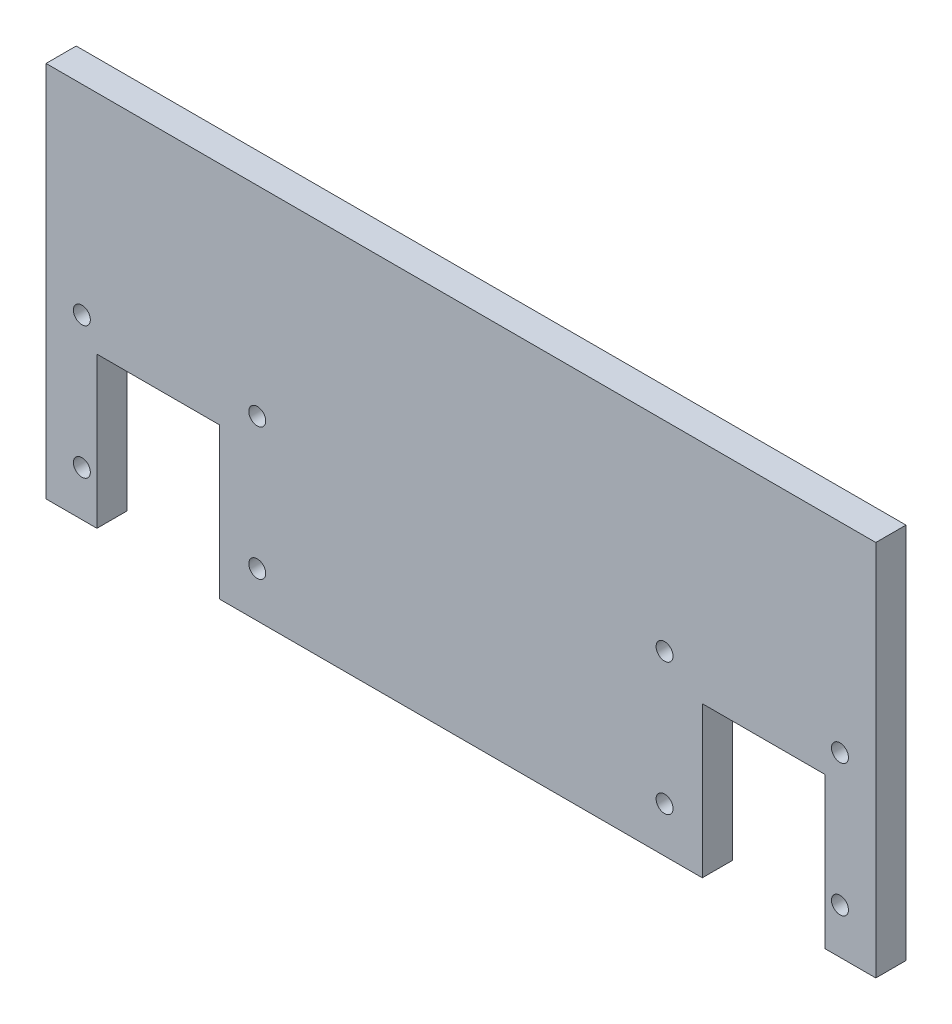
ISO-10303-21;
HEADER;
FILE_DESCRIPTION(('STEP AP214'),'2;1');
FILE_NAME('part.step','',(''),(''),'','','');
FILE_SCHEMA(('AUTOMOTIVE_DESIGN { 1 0 10303 214 1 1 1 1 }'));
ENDSEC;
DATA;
#1=APPLICATION_CONTEXT('core data for automotive mechanical design processes');
#2=APPLICATION_PROTOCOL_DEFINITION('international standard','automotive_design',2000,#1);
#3=PRODUCT_CONTEXT('',#1,'mechanical');
#4=PRODUCT('Part','Part','',(#3));
#5=PRODUCT_RELATED_PRODUCT_CATEGORY('part','',(#4));
#6=PRODUCT_DEFINITION_FORMATION('','',#4);
#7=PRODUCT_DEFINITION_CONTEXT('part definition',#1,'design');
#8=PRODUCT_DEFINITION('design','',#6,#7);
#9=PRODUCT_DEFINITION_SHAPE('','',#8);
#10=(LENGTH_UNIT() NAMED_UNIT(*) SI_UNIT(.MILLI.,.METRE.));
#11=(NAMED_UNIT(*) PLANE_ANGLE_UNIT() SI_UNIT($,.RADIAN.));
#12=(NAMED_UNIT(*) SI_UNIT($,.STERADIAN.) SOLID_ANGLE_UNIT());
#13=UNCERTAINTY_MEASURE_WITH_UNIT(LENGTH_MEASURE(1.E-05),#10,'distance_accuracy_value','');
#14=(GEOMETRIC_REPRESENTATION_CONTEXT(3) GLOBAL_UNCERTAINTY_ASSIGNED_CONTEXT((#13)) GLOBAL_UNIT_ASSIGNED_CONTEXT((#10,
#11,#12)) REPRESENTATION_CONTEXT('',''));
#15=CARTESIAN_POINT('',(0.,0.,0.));
#16=DIRECTION('',(0.,0.,1.));
#17=DIRECTION('',(1.,0.,0.));
#18=AXIS2_PLACEMENT_3D('',#15,#16,#17);
#19=CARTESIAN_POINT('',(0.,0.,8.));
#20=DIRECTION('',(0.,1.,0.));
#21=DIRECTION('',(0.,0.,1.));
#22=AXIS2_PLACEMENT_3D('',#19,#20,#21);
#23=PLANE('',#22);
#24=CARTESIAN_POINT('',(110.,0.,4.));
#25=DIRECTION('',(0.,-1.,0.));
#26=DIRECTION('',(0.,0.,-1.));
#27=AXIS2_PLACEMENT_3D('',#24,#25,#26);
#28=CIRCLE('',#27,2.);
#29=CARTESIAN_POINT('',(110.,0.,2.));
#30=VERTEX_POINT('',#29);
#31=EDGE_CURVE('E185',#30,#30,#28,.T.);
#32=ORIENTED_EDGE('',*,*,#31,.F.);
#33=EDGE_LOOP('',(#32));
#34=FACE_BOUND('',#33,.T.);
#35=DIRECTION('',(1.,0.,0.));
#36=VECTOR('',#35,1.);
#37=CARTESIAN_POINT('',(0.,0.,0.));
#38=LINE('',#37,#36);
#39=CARTESIAN_POINT('',(46.,0.,0.));
#40=VERTEX_POINT('',#39);
#41=CARTESIAN_POINT('',(174.,0.,0.));
#42=VERTEX_POINT('',#41);
#43=EDGE_CURVE('E147',#40,#42,#38,.T.);
#44=ORIENTED_EDGE('',*,*,#43,.T.);
#45=DIRECTION('',(0.,0.,1.));
#46=VECTOR('',#45,1.);
#47=CARTESIAN_POINT('',(174.,0.,0.));
#48=LINE('',#47,#46);
#49=CARTESIAN_POINT('',(174.,0.,8.));
#50=VERTEX_POINT('',#49);
#51=EDGE_CURVE('E234',#42,#50,#48,.T.);
#52=ORIENTED_EDGE('',*,*,#51,.T.);
#53=DIRECTION('',(1.,0.,0.));
#54=VECTOR('',#53,1.);
#55=CARTESIAN_POINT('',(0.,0.,8.));
#56=LINE('',#55,#54);
#57=CARTESIAN_POINT('',(46.,0.,8.));
#58=VERTEX_POINT('',#57);
#59=EDGE_CURVE('E180',#58,#50,#56,.T.);
#60=ORIENTED_EDGE('',*,*,#59,.F.);
#61=DIRECTION('',(0.,0.,1.));
#62=VECTOR('',#61,1.);
#63=CARTESIAN_POINT('',(46.,0.,0.));
#64=LINE('',#63,#62);
#65=EDGE_CURVE('E214',#40,#58,#64,.T.);
#66=ORIENTED_EDGE('',*,*,#65,.F.);
#67=EDGE_LOOP('',(#44,#52,#60,#66));
#68=FACE_BOUND('',#67,.T.);
#69=ADVANCED_FACE('F33',(#34,#68),#23,.F.);
#70=CARTESIAN_POINT('',(6.99999999999998,0.,4.));
#71=DIRECTION('',(0.,-1.,0.));
#72=DIRECTION('',(0.,0.,1.));
#73=AXIS2_PLACEMENT_3D('',#70,#71,#72);
#74=CIRCLE('',#73,2.);
#75=CARTESIAN_POINT('',(6.99999999999998,0.,6.));
#76=VERTEX_POINT('',#75);
#77=EDGE_CURVE('E191',#76,#76,#74,.T.);
#78=ORIENTED_EDGE('',*,*,#77,.F.);
#79=EDGE_LOOP('',(#78));
#80=FACE_BOUND('',#79,.T.);
#81=CARTESIAN_POINT('',(0.,0.,0.));
#82=VERTEX_POINT('',#81);
#83=CARTESIAN_POINT('',(13.5,0.,0.));
#84=VERTEX_POINT('',#83);
#85=EDGE_CURVE('E150',#82,#84,#38,.T.);
#86=ORIENTED_EDGE('',*,*,#85,.T.);
#87=DIRECTION('',(0.,0.,1.));
#88=VECTOR('',#87,1.);
#89=CARTESIAN_POINT('',(13.5,0.,0.));
#90=LINE('',#89,#88);
#91=CARTESIAN_POINT('',(13.5,0.,8.));
#92=VERTEX_POINT('',#91);
#93=EDGE_CURVE('E212',#84,#92,#90,.T.);
#94=ORIENTED_EDGE('',*,*,#93,.T.);
#95=CARTESIAN_POINT('',(0.,0.,8.));
#96=VERTEX_POINT('',#95);
#97=EDGE_CURVE('E176',#96,#92,#56,.T.);
#98=ORIENTED_EDGE('',*,*,#97,.F.);
#99=DIRECTION('',(0.,0.,-1.));
#100=VECTOR('',#99,1.);
#101=CARTESIAN_POINT('',(0.,0.,8.));
#102=LINE('',#101,#100);
#103=EDGE_CURVE('E11',#96,#82,#102,.T.);
#104=ORIENTED_EDGE('',*,*,#103,.T.);
#105=EDGE_LOOP('',(#86,#94,#98,#104));
#106=FACE_BOUND('',#105,.T.);
#107=ADVANCED_FACE('F330',(#80,#106),#23,.F.);
#108=CARTESIAN_POINT('',(0.,0.,8.));
#109=DIRECTION('',(1.,0.,0.));
#110=DIRECTION('',(0.,0.,-1.));
#111=AXIS2_PLACEMENT_3D('',#108,#109,#110);
#112=PLANE('',#111);
#113=DIRECTION('',(0.,-1.,0.));
#114=VECTOR('',#113,1.);
#115=CARTESIAN_POINT('',(0.,0.,0.));
#116=LINE('',#115,#114);
#117=CARTESIAN_POINT('',(0.,100.,0.));
#118=VERTEX_POINT('',#117);
#119=EDGE_CURVE('E148',#118,#82,#116,.T.);
#120=ORIENTED_EDGE('',*,*,#119,.T.);
#121=ORIENTED_EDGE('',*,*,#103,.F.);
#122=DIRECTION('',(0.,-1.,0.));
#123=VECTOR('',#122,1.);
#124=CARTESIAN_POINT('',(0.,0.,8.));
#125=LINE('',#124,#123);
#126=CARTESIAN_POINT('',(0.,100.,8.));
#127=VERTEX_POINT('',#126);
#128=EDGE_CURVE('E163',#127,#96,#125,.T.);
#129=ORIENTED_EDGE('',*,*,#128,.F.);
#130=DIRECTION('',(0.,0.,-1.));
#131=VECTOR('',#130,1.);
#132=CARTESIAN_POINT('',(0.,100.,8.));
#133=LINE('',#132,#131);
#134=EDGE_CURVE('E166',#127,#118,#133,.T.);
#135=ORIENTED_EDGE('',*,*,#134,.T.);
#136=EDGE_LOOP('',(#120,#121,#129,#135));
#137=FACE_BOUND('',#136,.T.);
#138=ADVANCED_FACE('F35',(#137),#112,.F.);
#139=CARTESIAN_POINT('',(213.,0.,4.));
#140=DIRECTION('',(0.,-1.,0.));
#141=DIRECTION('',(0.,0.,-1.));
#142=AXIS2_PLACEMENT_3D('',#139,#140,#141);
#143=CIRCLE('',#142,2.);
#144=CARTESIAN_POINT('',(213.,0.,2.));
#145=VERTEX_POINT('',#144);
#146=EDGE_CURVE('E198',#145,#145,#143,.T.);
#147=ORIENTED_EDGE('',*,*,#146,.F.);
#148=EDGE_LOOP('',(#147));
#149=FACE_BOUND('',#148,.T.);
#150=CARTESIAN_POINT('',(206.5,0.,8.));
#151=VERTEX_POINT('',#150);
#152=CARTESIAN_POINT('',(220.,0.,8.));
#153=VERTEX_POINT('',#152);
#154=EDGE_CURVE('E139',#151,#153,#56,.T.);
#155=ORIENTED_EDGE('',*,*,#154,.F.);
#156=DIRECTION('',(0.,0.,1.));
#157=VECTOR('',#156,1.);
#158=CARTESIAN_POINT('',(206.5,0.,0.));
#159=LINE('',#158,#157);
#160=CARTESIAN_POINT('',(206.5,0.,0.));
#161=VERTEX_POINT('',#160);
#162=EDGE_CURVE('E126',#161,#151,#159,.T.);
#163=ORIENTED_EDGE('',*,*,#162,.F.);
#164=CARTESIAN_POINT('',(220.,0.,0.));
#165=VERTEX_POINT('',#164);
#166=EDGE_CURVE('E137',#161,#165,#38,.T.);
#167=ORIENTED_EDGE('',*,*,#166,.T.);
#168=DIRECTION('',(0.,0.,-1.));
#169=VECTOR('',#168,1.);
#170=CARTESIAN_POINT('',(220.,0.,8.));
#171=LINE('',#170,#169);
#172=EDGE_CURVE('E41',#153,#165,#171,.T.);
#173=ORIENTED_EDGE('',*,*,#172,.F.);
#174=EDGE_LOOP('',(#155,#163,#167,#173));
#175=FACE_BOUND('',#174,.T.);
#176=ADVANCED_FACE('F135',(#149,#175),#23,.F.);
#177=CARTESIAN_POINT('',(220.,0.,8.));
#178=DIRECTION('',(-1.,0.,0.));
#179=DIRECTION('',(0.,0.,1.));
#180=AXIS2_PLACEMENT_3D('',#177,#178,#179);
#181=PLANE('',#180);
#182=DIRECTION('',(0.,1.,0.));
#183=VECTOR('',#182,1.);
#184=CARTESIAN_POINT('',(220.,0.,0.));
#185=LINE('',#184,#183);
#186=CARTESIAN_POINT('',(220.,100.,0.));
#187=VERTEX_POINT('',#186);
#188=EDGE_CURVE('E146',#165,#187,#185,.T.);
#189=ORIENTED_EDGE('',*,*,#188,.T.);
#190=DIRECTION('',(0.,0.,-1.));
#191=VECTOR('',#190,1.);
#192=CARTESIAN_POINT('',(220.,100.,8.));
#193=LINE('',#192,#191);
#194=CARTESIAN_POINT('',(220.,100.,8.));
#195=VERTEX_POINT('',#194);
#196=EDGE_CURVE('E169',#195,#187,#193,.T.);
#197=ORIENTED_EDGE('',*,*,#196,.F.);
#198=DIRECTION('',(0.,1.,0.));
#199=VECTOR('',#198,1.);
#200=CARTESIAN_POINT('',(220.,0.,8.));
#201=LINE('',#200,#199);
#202=EDGE_CURVE('E173',#153,#195,#201,.T.);
#203=ORIENTED_EDGE('',*,*,#202,.F.);
#204=ORIENTED_EDGE('',*,*,#172,.T.);
#205=EDGE_LOOP('',(#189,#197,#203,#204));
#206=FACE_BOUND('',#205,.T.);
#207=ADVANCED_FACE('F172',(#206),#181,.F.);
#208=CARTESIAN_POINT('',(0.,100.,8.));
#209=DIRECTION('',(0.,-1.,0.));
#210=DIRECTION('',(0.,0.,-1.));
#211=AXIS2_PLACEMENT_3D('',#208,#209,#210);
#212=PLANE('',#211);
#213=DIRECTION('',(-1.,0.,0.));
#214=VECTOR('',#213,1.);
#215=CARTESIAN_POINT('',(0.,100.,0.));
#216=LINE('',#215,#214);
#217=EDGE_CURVE('E159',#187,#118,#216,.T.);
#218=ORIENTED_EDGE('',*,*,#217,.T.);
#219=ORIENTED_EDGE('',*,*,#134,.F.);
#220=DIRECTION('',(-1.,0.,0.));
#221=VECTOR('',#220,1.);
#222=CARTESIAN_POINT('',(0.,100.,8.));
#223=LINE('',#222,#221);
#224=EDGE_CURVE('E170',#195,#127,#223,.T.);
#225=ORIENTED_EDGE('',*,*,#224,.F.);
#226=ORIENTED_EDGE('',*,*,#196,.T.);
#227=EDGE_LOOP('',(#218,#219,#225,#226));
#228=FACE_BOUND('',#227,.T.);
#229=ADVANCED_FACE('F305',(#228),#212,.F.);
#230=CARTESIAN_POINT('',(0.,0.,8.));
#231=DIRECTION('',(0.,0.,-1.));
#232=DIRECTION('',(-1.,0.,0.));
#233=AXIS2_PLACEMENT_3D('',#230,#231,#232);
#234=PLANE('',#233);
#235=CARTESIAN_POINT('',(164.,47.,8.));
#236=DIRECTION('',(0.,0.,-1.));
#237=DIRECTION('',(-1.,0.,0.));
#238=AXIS2_PLACEMENT_3D('',#235,#236,#237);
#239=CIRCLE('',#238,2.25000000000001);
#240=CARTESIAN_POINT('',(161.75,47.,8.));
#241=VERTEX_POINT('',#240);
#242=EDGE_CURVE('E249',#241,#241,#239,.T.);
#243=ORIENTED_EDGE('',*,*,#242,.T.);
#244=EDGE_LOOP('',(#243));
#245=FACE_BOUND('',#244,.T.);
#246=CARTESIAN_POINT('',(164.,12.,8.));
#247=DIRECTION('',(0.,0.,-1.));
#248=DIRECTION('',(-1.,0.,0.));
#249=AXIS2_PLACEMENT_3D('',#246,#247,#248);
#250=CIRCLE('',#249,2.25000000000001);
#251=CARTESIAN_POINT('',(161.75,12.,8.));
#252=VERTEX_POINT('',#251);
#253=EDGE_CURVE('E252',#252,#252,#250,.T.);
#254=ORIENTED_EDGE('',*,*,#253,.T.);
#255=EDGE_LOOP('',(#254));
#256=FACE_BOUND('',#255,.T.);
#257=CARTESIAN_POINT('',(56.,12.,8.));
#258=DIRECTION('',(0.,0.,-1.));
#259=DIRECTION('',(-1.,0.,0.));
#260=AXIS2_PLACEMENT_3D('',#257,#258,#259);
#261=CIRCLE('',#260,2.25);
#262=CARTESIAN_POINT('',(53.75,12.,8.));
#263=VERTEX_POINT('',#262);
#264=EDGE_CURVE('E255',#263,#263,#261,.T.);
#265=ORIENTED_EDGE('',*,*,#264,.T.);
#266=EDGE_LOOP('',(#265));
#267=FACE_BOUND('',#266,.T.);
#268=CARTESIAN_POINT('',(56.,47.,8.));
#269=DIRECTION('',(0.,0.,-1.));
#270=DIRECTION('',(-1.,0.,0.));
#271=AXIS2_PLACEMENT_3D('',#268,#269,#270);
#272=CIRCLE('',#271,2.25);
#273=CARTESIAN_POINT('',(53.75,47.,8.));
#274=VERTEX_POINT('',#273);
#275=EDGE_CURVE('E258',#274,#274,#272,.T.);
#276=ORIENTED_EDGE('',*,*,#275,.T.);
#277=EDGE_LOOP('',(#276));
#278=FACE_BOUND('',#277,.T.);
#279=CARTESIAN_POINT('',(210.5,12.,8.));
#280=DIRECTION('',(0.,0.,-1.));
#281=DIRECTION('',(-1.,0.,0.));
#282=AXIS2_PLACEMENT_3D('',#279,#280,#281);
#283=CIRCLE('',#282,2.25000000000001);
#284=CARTESIAN_POINT('',(208.25,12.,8.));
#285=VERTEX_POINT('',#284);
#286=EDGE_CURVE('E261',#285,#285,#283,.T.);
#287=ORIENTED_EDGE('',*,*,#286,.T.);
#288=EDGE_LOOP('',(#287));
#289=FACE_BOUND('',#288,.T.);
#290=CARTESIAN_POINT('',(210.5,47.,8.));
#291=DIRECTION('',(0.,0.,-1.));
#292=DIRECTION('',(-1.,0.,0.));
#293=AXIS2_PLACEMENT_3D('',#290,#291,#292);
#294=CIRCLE('',#293,2.25000000000001);
#295=CARTESIAN_POINT('',(208.25,47.,8.));
#296=VERTEX_POINT('',#295);
#297=EDGE_CURVE('E264',#296,#296,#294,.T.);
#298=ORIENTED_EDGE('',*,*,#297,.T.);
#299=EDGE_LOOP('',(#298));
#300=FACE_BOUND('',#299,.T.);
#301=CARTESIAN_POINT('',(9.5,47.,8.));
#302=DIRECTION('',(0.,0.,-1.));
#303=DIRECTION('',(-1.,0.,0.));
#304=AXIS2_PLACEMENT_3D('',#301,#302,#303);
#305=CIRCLE('',#304,2.25);
#306=CARTESIAN_POINT('',(7.25,47.,8.));
#307=VERTEX_POINT('',#306);
#308=EDGE_CURVE('E267',#307,#307,#305,.T.);
#309=ORIENTED_EDGE('',*,*,#308,.T.);
#310=EDGE_LOOP('',(#309));
#311=FACE_BOUND('',#310,.T.);
#312=CARTESIAN_POINT('',(9.5,12.,8.));
#313=DIRECTION('',(0.,0.,-1.));
#314=DIRECTION('',(-1.,0.,0.));
#315=AXIS2_PLACEMENT_3D('',#312,#313,#314);
#316=CIRCLE('',#315,2.25);
#317=CARTESIAN_POINT('',(7.25,12.,8.));
#318=VERTEX_POINT('',#317);
#319=EDGE_CURVE('E131',#318,#318,#316,.T.);
#320=ORIENTED_EDGE('',*,*,#319,.T.);
#321=EDGE_LOOP('',(#320));
#322=FACE_BOUND('',#321,.T.);
#323=ORIENTED_EDGE('',*,*,#59,.T.);
#324=DIRECTION('',(0.,1.,0.));
#325=VECTOR('',#324,1.);
#326=CARTESIAN_POINT('',(174.,0.,8.));
#327=LINE('',#326,#325);
#328=CARTESIAN_POINT('',(174.,40.,8.));
#329=VERTEX_POINT('',#328);
#330=EDGE_CURVE('E227',#50,#329,#327,.T.);
#331=ORIENTED_EDGE('',*,*,#330,.T.);
#332=DIRECTION('',(1.,0.,0.));
#333=VECTOR('',#332,1.);
#334=CARTESIAN_POINT('',(0.,40.,8.));
#335=LINE('',#334,#333);
#336=CARTESIAN_POINT('',(206.5,40.,8.));
#337=VERTEX_POINT('',#336);
#338=EDGE_CURVE('E230',#329,#337,#335,.T.);
#339=ORIENTED_EDGE('',*,*,#338,.T.);
#340=DIRECTION('',(0.,-1.,0.));
#341=VECTOR('',#340,1.);
#342=CARTESIAN_POINT('',(206.5,0.,8.));
#343=LINE('',#342,#341);
#344=EDGE_CURVE('E233',#337,#151,#343,.T.);
#345=ORIENTED_EDGE('',*,*,#344,.T.);
#346=ORIENTED_EDGE('',*,*,#154,.T.);
#347=ORIENTED_EDGE('',*,*,#202,.T.);
#348=ORIENTED_EDGE('',*,*,#224,.T.);
#349=ORIENTED_EDGE('',*,*,#128,.T.);
#350=ORIENTED_EDGE('',*,*,#97,.T.);
#351=DIRECTION('',(0.,1.,0.));
#352=VECTOR('',#351,1.);
#353=CARTESIAN_POINT('',(13.5,0.,8.));
#354=LINE('',#353,#352);
#355=CARTESIAN_POINT('',(13.5,40.,8.));
#356=VERTEX_POINT('',#355);
#357=EDGE_CURVE('E195',#92,#356,#354,.T.);
#358=ORIENTED_EDGE('',*,*,#357,.T.);
#359=DIRECTION('',(1.,0.,0.));
#360=VECTOR('',#359,1.);
#361=CARTESIAN_POINT('',(0.,40.,8.));
#362=LINE('',#361,#360);
#363=CARTESIAN_POINT('',(46.,40.,8.));
#364=VERTEX_POINT('',#363);
#365=EDGE_CURVE('E205',#356,#364,#362,.T.);
#366=ORIENTED_EDGE('',*,*,#365,.T.);
#367=DIRECTION('',(0.,-1.,0.));
#368=VECTOR('',#367,1.);
#369=CARTESIAN_POINT('',(46.,0.,8.));
#370=LINE('',#369,#368);
#371=EDGE_CURVE('E208',#364,#58,#370,.T.);
#372=ORIENTED_EDGE('',*,*,#371,.T.);
#373=EDGE_LOOP('',(#323,#331,#339,#345,#346,#347,#348,#349,#350,#358,#366,#372));
#374=FACE_BOUND('',#373,.T.);
#375=ADVANCED_FACE('F302',(#245,#256,#267,#278,#289,#300,#311,#322,#374),#234,.F.);
#376=CARTESIAN_POINT('',(0.,0.,0.));
#377=DIRECTION('',(0.,0.,-1.));
#378=DIRECTION('',(-1.,0.,0.));
#379=AXIS2_PLACEMENT_3D('',#376,#377,#378);
#380=PLANE('',#379);
#381=CARTESIAN_POINT('',(164.,47.,0.));
#382=DIRECTION('',(0.,0.,1.));
#383=DIRECTION('',(1.,0.,0.));
#384=AXIS2_PLACEMENT_3D('',#381,#382,#383);
#385=CIRCLE('',#384,2.25000000000001);
#386=CARTESIAN_POINT('',(166.25,47.,0.));
#387=VERTEX_POINT('',#386);
#388=EDGE_CURVE('E280',#387,#387,#385,.T.);
#389=ORIENTED_EDGE('',*,*,#388,.T.);
#390=EDGE_LOOP('',(#389));
#391=FACE_BOUND('',#390,.T.);
#392=CARTESIAN_POINT('',(164.,12.,0.));
#393=DIRECTION('',(0.,0.,1.));
#394=DIRECTION('',(1.,0.,0.));
#395=AXIS2_PLACEMENT_3D('',#392,#393,#394);
#396=CIRCLE('',#395,2.25000000000001);
#397=CARTESIAN_POINT('',(166.25,12.,0.));
#398=VERTEX_POINT('',#397);
#399=EDGE_CURVE('E283',#398,#398,#396,.T.);
#400=ORIENTED_EDGE('',*,*,#399,.T.);
#401=EDGE_LOOP('',(#400));
#402=FACE_BOUND('',#401,.T.);
#403=CARTESIAN_POINT('',(56.,12.,0.));
#404=DIRECTION('',(0.,0.,1.));
#405=DIRECTION('',(-1.,0.,0.));
#406=AXIS2_PLACEMENT_3D('',#403,#404,#405);
#407=CIRCLE('',#406,2.25);
#408=CARTESIAN_POINT('',(53.75,12.,0.));
#409=VERTEX_POINT('',#408);
#410=EDGE_CURVE('E286',#409,#409,#407,.T.);
#411=ORIENTED_EDGE('',*,*,#410,.T.);
#412=EDGE_LOOP('',(#411));
#413=FACE_BOUND('',#412,.T.);
#414=CARTESIAN_POINT('',(56.,47.,0.));
#415=DIRECTION('',(0.,0.,1.));
#416=DIRECTION('',(-1.,0.,0.));
#417=AXIS2_PLACEMENT_3D('',#414,#415,#416);
#418=CIRCLE('',#417,2.25);
#419=CARTESIAN_POINT('',(53.75,47.,0.));
#420=VERTEX_POINT('',#419);
#421=EDGE_CURVE('E275',#420,#420,#418,.T.);
#422=ORIENTED_EDGE('',*,*,#421,.T.);
#423=EDGE_LOOP('',(#422));
#424=FACE_BOUND('',#423,.T.);
#425=CARTESIAN_POINT('',(210.5,12.,0.));
#426=DIRECTION('',(0.,0.,1.));
#427=DIRECTION('',(-1.,0.,0.));
#428=AXIS2_PLACEMENT_3D('',#425,#426,#427);
#429=CIRCLE('',#428,2.25000000000001);
#430=CARTESIAN_POINT('',(208.25,12.,0.));
#431=VERTEX_POINT('',#430);
#432=EDGE_CURVE('E271',#431,#431,#429,.T.);
#433=ORIENTED_EDGE('',*,*,#432,.T.);
#434=EDGE_LOOP('',(#433));
#435=FACE_BOUND('',#434,.T.);
#436=CARTESIAN_POINT('',(210.5,47.,0.));
#437=DIRECTION('',(0.,0.,1.));
#438=DIRECTION('',(-1.,0.,0.));
#439=AXIS2_PLACEMENT_3D('',#436,#437,#438);
#440=CIRCLE('',#439,2.25000000000001);
#441=CARTESIAN_POINT('',(208.25,47.,0.));
#442=VERTEX_POINT('',#441);
#443=EDGE_CURVE('E274',#442,#442,#440,.T.);
#444=ORIENTED_EDGE('',*,*,#443,.T.);
#445=EDGE_LOOP('',(#444));
#446=FACE_BOUND('',#445,.T.);
#447=CARTESIAN_POINT('',(9.5,47.,0.));
#448=DIRECTION('',(0.,0.,1.));
#449=DIRECTION('',(1.,0.,0.));
#450=AXIS2_PLACEMENT_3D('',#447,#448,#449);
#451=CIRCLE('',#450,2.25);
#452=CARTESIAN_POINT('',(11.75,47.,0.));
#453=VERTEX_POINT('',#452);
#454=EDGE_CURVE('E270',#453,#453,#451,.T.);
#455=ORIENTED_EDGE('',*,*,#454,.T.);
#456=EDGE_LOOP('',(#455));
#457=FACE_BOUND('',#456,.T.);
#458=CARTESIAN_POINT('',(9.5,12.,0.));
#459=DIRECTION('',(0.,0.,1.));
#460=DIRECTION('',(1.,0.,0.));
#461=AXIS2_PLACEMENT_3D('',#458,#459,#460);
#462=CIRCLE('',#461,2.25);
#463=CARTESIAN_POINT('',(11.75,12.,0.));
#464=VERTEX_POINT('',#463);
#465=EDGE_CURVE('E246',#464,#464,#462,.T.);
#466=ORIENTED_EDGE('',*,*,#465,.T.);
#467=EDGE_LOOP('',(#466));
#468=FACE_BOUND('',#467,.T.);
#469=DIRECTION('',(0.,-1.,0.));
#470=VECTOR('',#469,1.);
#471=CARTESIAN_POINT('',(174.,0.,0.));
#472=LINE('',#471,#470);
#473=CARTESIAN_POINT('',(174.,40.,0.));
#474=VERTEX_POINT('',#473);
#475=EDGE_CURVE('E140',#474,#42,#472,.T.);
#476=ORIENTED_EDGE('',*,*,#475,.T.);
#477=ORIENTED_EDGE('',*,*,#43,.F.);
#478=DIRECTION('',(0.,1.,0.));
#479=VECTOR('',#478,1.);
#480=CARTESIAN_POINT('',(46.,0.,0.));
#481=LINE('',#480,#479);
#482=CARTESIAN_POINT('',(46.,40.,0.));
#483=VERTEX_POINT('',#482);
#484=EDGE_CURVE('E221',#40,#483,#481,.T.);
#485=ORIENTED_EDGE('',*,*,#484,.T.);
#486=DIRECTION('',(-1.,0.,0.));
#487=VECTOR('',#486,1.);
#488=CARTESIAN_POINT('',(13.5,40.,0.));
#489=LINE('',#488,#487);
#490=CARTESIAN_POINT('',(13.5,40.,0.));
#491=VERTEX_POINT('',#490);
#492=EDGE_CURVE('E56',#483,#491,#489,.T.);
#493=ORIENTED_EDGE('',*,*,#492,.T.);
#494=DIRECTION('',(0.,-1.,0.));
#495=VECTOR('',#494,1.);
#496=CARTESIAN_POINT('',(13.5,0.,0.));
#497=LINE('',#496,#495);
#498=EDGE_CURVE('E224',#491,#84,#497,.T.);
#499=ORIENTED_EDGE('',*,*,#498,.T.);
#500=ORIENTED_EDGE('',*,*,#85,.F.);
#501=ORIENTED_EDGE('',*,*,#119,.F.);
#502=ORIENTED_EDGE('',*,*,#217,.F.);
#503=ORIENTED_EDGE('',*,*,#188,.F.);
#504=ORIENTED_EDGE('',*,*,#166,.F.);
#505=DIRECTION('',(0.,1.,0.));
#506=VECTOR('',#505,1.);
#507=CARTESIAN_POINT('',(206.5,0.,0.));
#508=LINE('',#507,#506);
#509=CARTESIAN_POINT('',(206.5,40.,0.));
#510=VERTEX_POINT('',#509);
#511=EDGE_CURVE('E123',#161,#510,#508,.T.);
#512=ORIENTED_EDGE('',*,*,#511,.T.);
#513=DIRECTION('',(-1.,0.,0.));
#514=VECTOR('',#513,1.);
#515=CARTESIAN_POINT('',(206.5,40.,0.));
#516=LINE('',#515,#514);
#517=EDGE_CURVE('E48',#510,#474,#516,.T.);
#518=ORIENTED_EDGE('',*,*,#517,.T.);
#519=EDGE_LOOP('',(#476,#477,#485,#493,#499,#500,#501,#502,#503,#504,#512,#518));
#520=FACE_BOUND('',#519,.T.);
#521=ADVANCED_FACE('F144',(#391,#402,#413,#424,#435,#446,#457,#468,#520),#380,.T.);
#522=CARTESIAN_POINT('',(110.,8.,4.));
#523=DIRECTION('',(0.,-1.,0.));
#524=DIRECTION('',(0.,0.,-1.));
#525=AXIS2_PLACEMENT_3D('',#522,#523,#524);
#526=CYLINDRICAL_SURFACE('',#525,2.);
#527=CARTESIAN_POINT('',(110.,8.,4.));
#528=DIRECTION('',(0.,-1.,0.));
#529=DIRECTION('',(0.,0.,-1.));
#530=AXIS2_PLACEMENT_3D('',#527,#528,#529);
#531=CIRCLE('',#530,2.);
#532=CARTESIAN_POINT('',(110.,8.,2.));
#533=VERTEX_POINT('',#532);
#534=EDGE_CURVE('E153',#533,#533,#531,.T.);
#535=ORIENTED_EDGE('',*,*,#534,.F.);
#536=EDGE_LOOP('',(#535));
#537=FACE_BOUND('',#536,.T.);
#538=ORIENTED_EDGE('',*,*,#31,.T.);
#539=EDGE_LOOP('',(#538));
#540=FACE_BOUND('',#539,.T.);
#541=ADVANCED_FACE('F381',(#537,#540),#526,.F.);
#542=CARTESIAN_POINT('',(110.,8.,4.));
#543=DIRECTION('',(0.,-1.,0.));
#544=DIRECTION('',(0.,0.,-1.));
#545=AXIS2_PLACEMENT_3D('',#542,#543,#544);
#546=PLANE('',#545);
#547=ORIENTED_EDGE('',*,*,#534,.T.);
#548=EDGE_LOOP('',(#547));
#549=FACE_BOUND('',#548,.T.);
#550=ADVANCED_FACE('F377',(#549),#546,.T.);
#551=CARTESIAN_POINT('',(6.99999999999998,8.,4.));
#552=DIRECTION('',(0.,-1.,0.));
#553=DIRECTION('',(0.,0.,-1.));
#554=AXIS2_PLACEMENT_3D('',#551,#552,#553);
#555=CYLINDRICAL_SURFACE('',#554,2.);
#556=CARTESIAN_POINT('',(6.99999999999998,8.,4.));
#557=DIRECTION('',(0.,-1.,0.));
#558=DIRECTION('',(0.,0.,1.));
#559=AXIS2_PLACEMENT_3D('',#556,#557,#558);
#560=CIRCLE('',#559,2.);
#561=CARTESIAN_POINT('',(6.99999999999998,8.,6.));
#562=VERTEX_POINT('',#561);
#563=EDGE_CURVE('E194',#562,#562,#560,.T.);
#564=ORIENTED_EDGE('',*,*,#563,.F.);
#565=EDGE_LOOP('',(#564));
#566=FACE_BOUND('',#565,.T.);
#567=ORIENTED_EDGE('',*,*,#77,.T.);
#568=EDGE_LOOP('',(#567));
#569=FACE_BOUND('',#568,.T.);
#570=ADVANCED_FACE('F369',(#566,#569),#555,.F.);
#571=CARTESIAN_POINT('',(6.99999999999998,8.,4.));
#572=DIRECTION('',(0.,1.,0.));
#573=DIRECTION('',(0.,0.,1.));
#574=AXIS2_PLACEMENT_3D('',#571,#572,#573);
#575=PLANE('',#574);
#576=ORIENTED_EDGE('',*,*,#563,.T.);
#577=EDGE_LOOP('',(#576));
#578=FACE_BOUND('',#577,.T.);
#579=ADVANCED_FACE('F360',(#578),#575,.F.);
#580=CARTESIAN_POINT('',(213.,8.,4.));
#581=DIRECTION('',(0.,-1.,0.));
#582=DIRECTION('',(0.,0.,-1.));
#583=AXIS2_PLACEMENT_3D('',#580,#581,#582);
#584=CYLINDRICAL_SURFACE('',#583,2.);
#585=CARTESIAN_POINT('',(213.,8.,4.));
#586=DIRECTION('',(0.,-1.,0.));
#587=DIRECTION('',(0.,0.,-1.));
#588=AXIS2_PLACEMENT_3D('',#585,#586,#587);
#589=CIRCLE('',#588,2.);
#590=CARTESIAN_POINT('',(213.,8.,2.));
#591=VERTEX_POINT('',#590);
#592=EDGE_CURVE('E188',#591,#591,#589,.T.);
#593=ORIENTED_EDGE('',*,*,#592,.F.);
#594=EDGE_LOOP('',(#593));
#595=FACE_BOUND('',#594,.T.);
#596=ORIENTED_EDGE('',*,*,#146,.T.);
#597=EDGE_LOOP('',(#596));
#598=FACE_BOUND('',#597,.T.);
#599=ADVANCED_FACE('F357',(#595,#598),#584,.F.);
#600=CARTESIAN_POINT('',(213.,8.,4.));
#601=DIRECTION('',(0.,-1.,0.));
#602=DIRECTION('',(0.,0.,-1.));
#603=AXIS2_PLACEMENT_3D('',#600,#601,#602);
#604=PLANE('',#603);
#605=ORIENTED_EDGE('',*,*,#592,.T.);
#606=EDGE_LOOP('',(#605));
#607=FACE_BOUND('',#606,.T.);
#608=ADVANCED_FACE('F359',(#607),#604,.T.);
#609=CARTESIAN_POINT('',(13.5,0.,0.));
#610=DIRECTION('',(-1.,0.,0.));
#611=DIRECTION('',(0.,0.,1.));
#612=AXIS2_PLACEMENT_3D('',#609,#610,#611);
#613=PLANE('',#612);
#614=ORIENTED_EDGE('',*,*,#93,.F.);
#615=ORIENTED_EDGE('',*,*,#498,.F.);
#616=DIRECTION('',(0.,0.,1.));
#617=VECTOR('',#616,1.);
#618=CARTESIAN_POINT('',(13.5,40.,0.));
#619=LINE('',#618,#617);
#620=EDGE_CURVE('E211',#491,#356,#619,.T.);
#621=ORIENTED_EDGE('',*,*,#620,.T.);
#622=ORIENTED_EDGE('',*,*,#357,.F.);
#623=EDGE_LOOP('',(#614,#615,#621,#622));
#624=FACE_BOUND('',#623,.T.);
#625=ADVANCED_FACE('F329',(#624),#613,.F.);
#626=CARTESIAN_POINT('',(13.5,40.,0.));
#627=DIRECTION('',(0.,1.,0.));
#628=DIRECTION('',(0.,0.,1.));
#629=AXIS2_PLACEMENT_3D('',#626,#627,#628);
#630=PLANE('',#629);
#631=ORIENTED_EDGE('',*,*,#620,.F.);
#632=ORIENTED_EDGE('',*,*,#492,.F.);
#633=DIRECTION('',(0.,0.,1.));
#634=VECTOR('',#633,1.);
#635=CARTESIAN_POINT('',(46.,40.,0.));
#636=LINE('',#635,#634);
#637=EDGE_CURVE('E216',#483,#364,#636,.T.);
#638=ORIENTED_EDGE('',*,*,#637,.T.);
#639=ORIENTED_EDGE('',*,*,#365,.F.);
#640=EDGE_LOOP('',(#631,#632,#638,#639));
#641=FACE_BOUND('',#640,.T.);
#642=ADVANCED_FACE('F432',(#641),#630,.F.);
#643=CARTESIAN_POINT('',(46.,0.,0.));
#644=DIRECTION('',(1.,0.,0.));
#645=DIRECTION('',(0.,0.,-1.));
#646=AXIS2_PLACEMENT_3D('',#643,#644,#645);
#647=PLANE('',#646);
#648=ORIENTED_EDGE('',*,*,#637,.F.);
#649=ORIENTED_EDGE('',*,*,#484,.F.);
#650=ORIENTED_EDGE('',*,*,#65,.T.);
#651=ORIENTED_EDGE('',*,*,#371,.F.);
#652=EDGE_LOOP('',(#648,#649,#650,#651));
#653=FACE_BOUND('',#652,.T.);
#654=ADVANCED_FACE('F325',(#653),#647,.F.);
#655=CARTESIAN_POINT('',(174.,0.,0.));
#656=DIRECTION('',(-1.,0.,0.));
#657=DIRECTION('',(0.,0.,1.));
#658=AXIS2_PLACEMENT_3D('',#655,#656,#657);
#659=PLANE('',#658);
#660=ORIENTED_EDGE('',*,*,#51,.F.);
#661=ORIENTED_EDGE('',*,*,#475,.F.);
#662=DIRECTION('',(0.,0.,1.));
#663=VECTOR('',#662,1.);
#664=CARTESIAN_POINT('',(174.,40.,0.));
#665=LINE('',#664,#663);
#666=EDGE_CURVE('E237',#474,#329,#665,.T.);
#667=ORIENTED_EDGE('',*,*,#666,.T.);
#668=ORIENTED_EDGE('',*,*,#330,.F.);
#669=EDGE_LOOP('',(#660,#661,#667,#668));
#670=FACE_BOUND('',#669,.T.);
#671=ADVANCED_FACE('F322',(#670),#659,.F.);
#672=CARTESIAN_POINT('',(206.5,40.,0.));
#673=DIRECTION('',(0.,1.,0.));
#674=DIRECTION('',(0.,0.,1.));
#675=AXIS2_PLACEMENT_3D('',#672,#673,#674);
#676=PLANE('',#675);
#677=ORIENTED_EDGE('',*,*,#666,.F.);
#678=ORIENTED_EDGE('',*,*,#517,.F.);
#679=DIRECTION('',(0.,0.,1.));
#680=VECTOR('',#679,1.);
#681=CARTESIAN_POINT('',(206.5,40.,0.));
#682=LINE('',#681,#680);
#683=EDGE_CURVE('E128',#510,#337,#682,.T.);
#684=ORIENTED_EDGE('',*,*,#683,.T.);
#685=ORIENTED_EDGE('',*,*,#338,.F.);
#686=EDGE_LOOP('',(#677,#678,#684,#685));
#687=FACE_BOUND('',#686,.T.);
#688=ADVANCED_FACE('F319',(#687),#676,.F.);
#689=CARTESIAN_POINT('',(206.5,0.,0.));
#690=DIRECTION('',(1.,0.,0.));
#691=DIRECTION('',(0.,0.,-1.));
#692=AXIS2_PLACEMENT_3D('',#689,#690,#691);
#693=PLANE('',#692);
#694=ORIENTED_EDGE('',*,*,#683,.F.);
#695=ORIENTED_EDGE('',*,*,#511,.F.);
#696=ORIENTED_EDGE('',*,*,#162,.T.);
#697=ORIENTED_EDGE('',*,*,#344,.F.);
#698=EDGE_LOOP('',(#694,#695,#696,#697));
#699=FACE_BOUND('',#698,.T.);
#700=ADVANCED_FACE('F125',(#699),#693,.F.);
#701=CARTESIAN_POINT('',(9.5,12.,0.));
#702=DIRECTION('',(0.,0.,1.));
#703=DIRECTION('',(1.,0.,0.));
#704=AXIS2_PLACEMENT_3D('',#701,#702,#703);
#705=CYLINDRICAL_SURFACE('',#704,2.25);
#706=ORIENTED_EDGE('',*,*,#465,.F.);
#707=EDGE_LOOP('',(#706));
#708=FACE_BOUND('',#707,.T.);
#709=ORIENTED_EDGE('',*,*,#319,.F.);
#710=EDGE_LOOP('',(#709));
#711=FACE_BOUND('',#710,.T.);
#712=ADVANCED_FACE('F415',(#708,#711),#705,.F.);
#713=CARTESIAN_POINT('',(9.5,47.,0.));
#714=DIRECTION('',(0.,0.,1.));
#715=DIRECTION('',(1.,0.,0.));
#716=AXIS2_PLACEMENT_3D('',#713,#714,#715);
#717=CYLINDRICAL_SURFACE('',#716,2.25);
#718=ORIENTED_EDGE('',*,*,#454,.F.);
#719=EDGE_LOOP('',(#718));
#720=FACE_BOUND('',#719,.T.);
#721=ORIENTED_EDGE('',*,*,#308,.F.);
#722=EDGE_LOOP('',(#721));
#723=FACE_BOUND('',#722,.T.);
#724=ADVANCED_FACE('F411',(#720,#723),#717,.F.);
#725=CARTESIAN_POINT('',(210.5,47.,0.));
#726=DIRECTION('',(0.,0.,1.));
#727=DIRECTION('',(1.,0.,0.));
#728=AXIS2_PLACEMENT_3D('',#725,#726,#727);
#729=CYLINDRICAL_SURFACE('',#728,2.25000000000001);
#730=ORIENTED_EDGE('',*,*,#443,.F.);
#731=EDGE_LOOP('',(#730));
#732=FACE_BOUND('',#731,.T.);
#733=ORIENTED_EDGE('',*,*,#297,.F.);
#734=EDGE_LOOP('',(#733));
#735=FACE_BOUND('',#734,.T.);
#736=ADVANCED_FACE('F414',(#732,#735),#729,.F.);
#737=CARTESIAN_POINT('',(210.5,12.,0.));
#738=DIRECTION('',(0.,0.,1.));
#739=DIRECTION('',(1.,0.,0.));
#740=AXIS2_PLACEMENT_3D('',#737,#738,#739);
#741=CYLINDRICAL_SURFACE('',#740,2.25000000000001);
#742=ORIENTED_EDGE('',*,*,#432,.F.);
#743=EDGE_LOOP('',(#742));
#744=FACE_BOUND('',#743,.T.);
#745=ORIENTED_EDGE('',*,*,#286,.F.);
#746=EDGE_LOOP('',(#745));
#747=FACE_BOUND('',#746,.T.);
#748=ADVANCED_FACE('F298',(#744,#747),#741,.F.);
#749=CARTESIAN_POINT('',(56.,47.,0.));
#750=DIRECTION('',(0.,0.,1.));
#751=DIRECTION('',(1.,0.,0.));
#752=AXIS2_PLACEMENT_3D('',#749,#750,#751);
#753=CYLINDRICAL_SURFACE('',#752,2.25);
#754=ORIENTED_EDGE('',*,*,#421,.F.);
#755=EDGE_LOOP('',(#754));
#756=FACE_BOUND('',#755,.T.);
#757=ORIENTED_EDGE('',*,*,#275,.F.);
#758=EDGE_LOOP('',(#757));
#759=FACE_BOUND('',#758,.T.);
#760=ADVANCED_FACE('F294',(#756,#759),#753,.F.);
#761=CARTESIAN_POINT('',(56.,12.,0.));
#762=DIRECTION('',(0.,0.,1.));
#763=DIRECTION('',(1.,0.,0.));
#764=AXIS2_PLACEMENT_3D('',#761,#762,#763);
#765=CYLINDRICAL_SURFACE('',#764,2.25);
#766=ORIENTED_EDGE('',*,*,#410,.F.);
#767=EDGE_LOOP('',(#766));
#768=FACE_BOUND('',#767,.T.);
#769=ORIENTED_EDGE('',*,*,#264,.F.);
#770=EDGE_LOOP('',(#769));
#771=FACE_BOUND('',#770,.T.);
#772=ADVANCED_FACE('F297',(#768,#771),#765,.F.);
#773=CARTESIAN_POINT('',(164.,12.,0.));
#774=DIRECTION('',(0.,0.,1.));
#775=DIRECTION('',(1.,0.,0.));
#776=AXIS2_PLACEMENT_3D('',#773,#774,#775);
#777=CYLINDRICAL_SURFACE('',#776,2.25000000000001);
#778=ORIENTED_EDGE('',*,*,#399,.F.);
#779=EDGE_LOOP('',(#778));
#780=FACE_BOUND('',#779,.T.);
#781=ORIENTED_EDGE('',*,*,#253,.F.);
#782=EDGE_LOOP('',(#781));
#783=FACE_BOUND('',#782,.T.);
#784=ADVANCED_FACE('F397',(#780,#783),#777,.F.);
#785=CARTESIAN_POINT('',(164.,47.,0.));
#786=DIRECTION('',(0.,0.,1.));
#787=DIRECTION('',(1.,0.,0.));
#788=AXIS2_PLACEMENT_3D('',#785,#786,#787);
#789=CYLINDRICAL_SURFACE('',#788,2.25000000000001);
#790=ORIENTED_EDGE('',*,*,#388,.F.);
#791=EDGE_LOOP('',(#790));
#792=FACE_BOUND('',#791,.T.);
#793=ORIENTED_EDGE('',*,*,#242,.F.);
#794=EDGE_LOOP('',(#793));
#795=FACE_BOUND('',#794,.T.);
#796=ADVANCED_FACE('F404',(#792,#795),#789,.F.);
#797=CLOSED_SHELL('',(#69,#107,#138,#176,#207,#229,#375,#521,#541,#550,#570,#579,#599,#608,#625,
#642,#654,#671,#688,#700,#712,#724,#736,#748,#760,#772,#784,#796));
#798=MANIFOLD_SOLID_BREP('B2',#797);
#799=ADVANCED_BREP_SHAPE_REPRESENTATION('',(#18,#798),#14);
#800=SHAPE_DEFINITION_REPRESENTATION(#9,#799);
ENDSEC;
END-ISO-10303-21;
